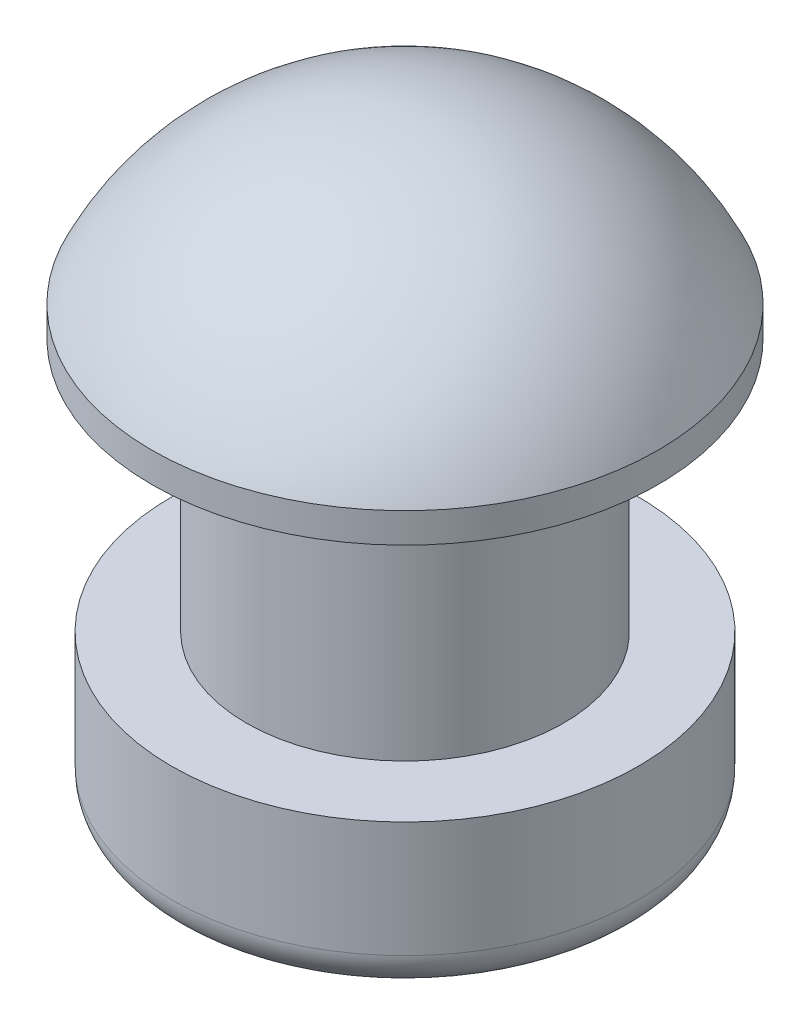
ISO-10303-21;
HEADER;
FILE_DESCRIPTION(('STEP AP214'),'2;1');
FILE_NAME('part.step','',(''),(''),'','','');
FILE_SCHEMA(('AUTOMOTIVE_DESIGN { 1 0 10303 214 1 1 1 1 }'));
ENDSEC;
DATA;
#1=APPLICATION_CONTEXT('core data for automotive mechanical design processes');
#2=APPLICATION_PROTOCOL_DEFINITION('international standard','automotive_design',2000,#1);
#3=PRODUCT_CONTEXT('',#1,'mechanical');
#4=PRODUCT('Part','Part','',(#3));
#5=PRODUCT_RELATED_PRODUCT_CATEGORY('part','',(#4));
#6=PRODUCT_DEFINITION_FORMATION('','',#4);
#7=PRODUCT_DEFINITION_CONTEXT('part definition',#1,'design');
#8=PRODUCT_DEFINITION('design','',#6,#7);
#9=PRODUCT_DEFINITION_SHAPE('','',#8);
#10=(LENGTH_UNIT() NAMED_UNIT(*) SI_UNIT(.MILLI.,.METRE.));
#11=(NAMED_UNIT(*) PLANE_ANGLE_UNIT() SI_UNIT($,.RADIAN.));
#12=(NAMED_UNIT(*) SI_UNIT($,.STERADIAN.) SOLID_ANGLE_UNIT());
#13=UNCERTAINTY_MEASURE_WITH_UNIT(LENGTH_MEASURE(1.E-05),#10,'distance_accuracy_value','');
#14=(GEOMETRIC_REPRESENTATION_CONTEXT(3) GLOBAL_UNCERTAINTY_ASSIGNED_CONTEXT((#13)) GLOBAL_UNIT_ASSIGNED_CONTEXT((#10,
#11,#12)) REPRESENTATION_CONTEXT('',''));
#15=CARTESIAN_POINT('',(0.,0.,0.));
#16=DIRECTION('',(0.,0.,1.));
#17=DIRECTION('',(1.,0.,0.));
#18=AXIS2_PLACEMENT_3D('',#15,#16,#17);
#19=CARTESIAN_POINT('',(0.,1.26999999999999,0.));
#20=DIRECTION('',(0.,1.,0.));
#21=DIRECTION('',(1.,0.,0.));
#22=AXIS2_PLACEMENT_3D('',#19,#20,#21);
#23=SPHERICAL_SURFACE('',#22,3.81);
#24=CARTESIAN_POINT('',(0.,2.8956,0.));
#25=DIRECTION('',(0.,1.,0.));
#26=DIRECTION('',(0.,0.,1.));
#27=AXIS2_PLACEMENT_3D('',#24,#25,#26);
#28=CIRCLE('',#27,3.44579811364508);
#29=CARTESIAN_POINT('',(0.,2.8956,3.44579811364508));
#30=VERTEX_POINT('',#29);
#31=EDGE_CURVE('E112',#30,#30,#28,.T.);
#32=ORIENTED_EDGE('',*,*,#31,.T.);
#33=EDGE_LOOP('',(#32));
#34=FACE_BOUND('',#33,.T.);
#35=ADVANCED_FACE('F36',(#34),#23,.T.);
#36=CARTESIAN_POINT('',(0.,5.37945263157895,0.));
#37=DIRECTION('',(0.,1.,0.));
#38=DIRECTION('',(0.,0.,1.));
#39=AXIS2_PLACEMENT_3D('',#36,#37,#38);
#40=CYLINDRICAL_SURFACE('',#39,3.44579811364508);
#41=ORIENTED_EDGE('',*,*,#31,.F.);
#42=EDGE_LOOP('',(#41));
#43=FACE_BOUND('',#42,.T.);
#44=CARTESIAN_POINT('',(0.,2.4892,0.));
#45=DIRECTION('',(0.,1.,0.));
#46=DIRECTION('',(0.,0.,1.));
#47=AXIS2_PLACEMENT_3D('',#44,#45,#46);
#48=CIRCLE('',#47,3.44579811364508);
#49=CARTESIAN_POINT('',(0.,2.4892,3.44579811364508));
#50=VERTEX_POINT('',#49);
#51=EDGE_CURVE('E109',#50,#50,#48,.T.);
#52=ORIENTED_EDGE('',*,*,#51,.T.);
#53=EDGE_LOOP('',(#52));
#54=FACE_BOUND('',#53,.T.);
#55=ADVANCED_FACE('F61',(#43,#54),#40,.T.);
#56=CARTESIAN_POINT('',(2.15899999999999,2.4892,0.));
#57=DIRECTION('',(0.,1.,0.));
#58=DIRECTION('',(0.,0.,1.));
#59=AXIS2_PLACEMENT_3D('',#56,#57,#58);
#60=PLANE('',#59);
#61=ORIENTED_EDGE('',*,*,#51,.F.);
#62=EDGE_LOOP('',(#61));
#63=FACE_BOUND('',#62,.T.);
#64=CARTESIAN_POINT('',(0.,2.4892,0.));
#65=DIRECTION('',(0.,1.,0.));
#66=DIRECTION('',(0.,0.,1.));
#67=AXIS2_PLACEMENT_3D('',#64,#65,#66);
#68=CIRCLE('',#67,2.159);
#69=CARTESIAN_POINT('',(0.,2.4892,2.159));
#70=VERTEX_POINT('',#69);
#71=EDGE_CURVE('E106',#70,#70,#68,.T.);
#72=ORIENTED_EDGE('',*,*,#71,.T.);
#73=EDGE_LOOP('',(#72));
#74=FACE_BOUND('',#73,.T.);
#75=ADVANCED_FACE('F66',(#63,#74),#60,.F.);
#76=CARTESIAN_POINT('',(0.,5.37945263157895,0.));
#77=DIRECTION('',(0.,1.,0.));
#78=DIRECTION('',(0.,0.,1.));
#79=AXIS2_PLACEMENT_3D('',#76,#77,#78);
#80=CYLINDRICAL_SURFACE('',#79,2.159);
#81=ORIENTED_EDGE('',*,*,#71,.F.);
#82=EDGE_LOOP('',(#81));
#83=FACE_BOUND('',#82,.T.);
#84=CARTESIAN_POINT('',(0.,-0.965199999999999,0.));
#85=DIRECTION('',(0.,1.,0.));
#86=DIRECTION('',(0.,0.,1.));
#87=AXIS2_PLACEMENT_3D('',#84,#85,#86);
#88=CIRCLE('',#87,2.159);
#89=CARTESIAN_POINT('',(0.,-0.965199999999999,2.159));
#90=VERTEX_POINT('',#89);
#91=EDGE_CURVE('E99',#90,#90,#88,.T.);
#92=ORIENTED_EDGE('',*,*,#91,.T.);
#93=EDGE_LOOP('',(#92));
#94=FACE_BOUND('',#93,.T.);
#95=ADVANCED_FACE('F73',(#83,#94),#80,.T.);
#96=CARTESIAN_POINT('',(3.17500000000001,-0.965199999999999,0.));
#97=DIRECTION('',(0.,-1.,0.));
#98=DIRECTION('',(0.,0.,-1.));
#99=AXIS2_PLACEMENT_3D('',#96,#97,#98);
#100=PLANE('',#99);
#101=ORIENTED_EDGE('',*,*,#91,.F.);
#102=EDGE_LOOP('',(#101));
#103=FACE_BOUND('',#102,.T.);
#104=CARTESIAN_POINT('',(0.,-0.965199999999999,0.));
#105=DIRECTION('',(0.,1.,0.));
#106=DIRECTION('',(0.,0.,1.));
#107=AXIS2_PLACEMENT_3D('',#104,#105,#106);
#108=CIRCLE('',#107,3.175);
#109=CARTESIAN_POINT('',(0.,-0.965199999999999,3.175));
#110=VERTEX_POINT('',#109);
#111=EDGE_CURVE('E95',#110,#110,#108,.T.);
#112=ORIENTED_EDGE('',*,*,#111,.T.);
#113=EDGE_LOOP('',(#112));
#114=FACE_BOUND('',#113,.T.);
#115=ADVANCED_FACE('F77',(#103,#114),#100,.F.);
#116=CARTESIAN_POINT('',(0.,5.37945263157895,0.));
#117=DIRECTION('',(0.,1.,0.));
#118=DIRECTION('',(0.,0.,1.));
#119=AXIS2_PLACEMENT_3D('',#116,#117,#118);
#120=CYLINDRICAL_SURFACE('',#119,3.175);
#121=CARTESIAN_POINT('',(0.,-2.54,0.));
#122=DIRECTION('',(0.,1.,0.));
#123=DIRECTION('',(0.,0.,1.));
#124=AXIS2_PLACEMENT_3D('',#121,#122,#123);
#125=CIRCLE('',#124,3.175);
#126=CARTESIAN_POINT('',(0.,-2.54,3.175));
#127=VERTEX_POINT('',#126);
#128=EDGE_CURVE('E43',#127,#127,#125,.T.);
#129=ORIENTED_EDGE('',*,*,#128,.T.);
#130=EDGE_LOOP('',(#129));
#131=FACE_BOUND('',#130,.T.);
#132=ORIENTED_EDGE('',*,*,#111,.F.);
#133=EDGE_LOOP('',(#132));
#134=FACE_BOUND('',#133,.T.);
#135=ADVANCED_FACE('F81',(#131,#134),#120,.T.);
#136=CARTESIAN_POINT('',(2.15899999999999,-3.048,0.));
#137=DIRECTION('',(0.,1.,0.));
#138=DIRECTION('',(0.,0.,1.));
#139=AXIS2_PLACEMENT_3D('',#136,#137,#138);
#140=PLANE('',#139);
#141=CARTESIAN_POINT('',(0.,-3.048,0.));
#142=DIRECTION('',(0.,1.,0.));
#143=DIRECTION('',(0.,0.,1.));
#144=AXIS2_PLACEMENT_3D('',#141,#142,#143);
#145=CIRCLE('',#144,2.667);
#146=CARTESIAN_POINT('',(0.,-3.048,2.667));
#147=VERTEX_POINT('',#146);
#148=EDGE_CURVE('E11',#147,#147,#145,.F.);
#149=ORIENTED_EDGE('',*,*,#148,.T.);
#150=EDGE_LOOP('',(#149));
#151=FACE_BOUND('',#150,.T.);
#152=CARTESIAN_POINT('',(0.,-3.048,0.));
#153=DIRECTION('',(0.,1.,0.));
#154=DIRECTION('',(0.,0.,1.));
#155=AXIS2_PLACEMENT_3D('',#152,#153,#154);
#156=CIRCLE('',#155,2.159);
#157=CARTESIAN_POINT('',(0.,-3.048,2.159));
#158=VERTEX_POINT('',#157);
#159=EDGE_CURVE('E94',#158,#158,#156,.T.);
#160=ORIENTED_EDGE('',*,*,#159,.T.);
#161=EDGE_LOOP('',(#160));
#162=FACE_BOUND('',#161,.T.);
#163=ADVANCED_FACE('F56',(#151,#162),#140,.F.);
#164=CARTESIAN_POINT('',(0.,5.37945263157895,0.));
#165=DIRECTION('',(0.,1.,0.));
#166=DIRECTION('',(0.,0.,1.));
#167=AXIS2_PLACEMENT_3D('',#164,#165,#166);
#168=CYLINDRICAL_SURFACE('',#167,2.159);
#169=ORIENTED_EDGE('',*,*,#159,.F.);
#170=EDGE_LOOP('',(#169));
#171=FACE_BOUND('',#170,.T.);
#172=CARTESIAN_POINT('',(0.,-1.778,0.));
#173=DIRECTION('',(0.,1.,0.));
#174=DIRECTION('',(0.,0.,1.));
#175=AXIS2_PLACEMENT_3D('',#172,#173,#174);
#176=CIRCLE('',#175,2.159);
#177=CARTESIAN_POINT('',(0.,-1.778,2.159));
#178=VERTEX_POINT('',#177);
#179=EDGE_CURVE('E96',#178,#178,#176,.T.);
#180=ORIENTED_EDGE('',*,*,#179,.T.);
#181=EDGE_LOOP('',(#180));
#182=FACE_BOUND('',#181,.T.);
#183=ADVANCED_FACE('F48',(#171,#182),#168,.F.);
#184=CARTESIAN_POINT('',(0.,-3.41280990949762,-0.998931690174505));
#185=DIRECTION('',(-1.,0.,0.));
#186=DIRECTION('',(0.,0.,1.));
#187=AXIS2_PLACEMENT_3D('',#184,#185,#186);
#188=CIRCLE('',#187,3.556);
#189=TRIMMED_CURVE('',#188,(PARAMETER_VALUE(-1.2860495605504)),
(PARAMETER_VALUE(1.2860495605504)),.T.,.PARAMETER.);
#190=CARTESIAN_POINT('',(0.,-3.41280990949762,0.));
#191=DIRECTION('',(0.,1.,0.));
#192=AXIS1_PLACEMENT('',#190,#191);
#193=SURFACE_OF_REVOLUTION('',#189,#192);
#194=ORIENTED_EDGE('',*,*,#179,.F.);
#195=EDGE_LOOP('',(#194));
#196=FACE_BOUND('',#195,.T.);
#197=CARTESIAN_POINT('',(0.,0.,0.));
#198=VERTEX_POINT('',#197);
#199=VERTEX_LOOP('',#198);
#200=FACE_BOUND('',#199,.T.);
#201=ADVANCED_FACE('F46',(#196,#200),#193,.F.);
#202=CARTESIAN_POINT('',(0.,-2.54,0.));
#203=DIRECTION('',(0.,1.,0.));
#204=DIRECTION('',(0.,0.,1.));
#205=AXIS2_PLACEMENT_3D('',#202,#203,#204);
#206=TOROIDAL_SURFACE('',#205,2.667,0.508);
#207=ORIENTED_EDGE('',*,*,#148,.F.);
#208=EDGE_LOOP('',(#207));
#209=FACE_BOUND('',#208,.T.);
#210=ORIENTED_EDGE('',*,*,#128,.F.);
#211=EDGE_LOOP('',(#210));
#212=FACE_BOUND('',#211,.T.);
#213=ADVANCED_FACE('F38',(#209,#212),#206,.T.);
#214=CLOSED_SHELL('',(#35,#55,#75,#95,#115,#135,#163,#183,#201,#213));
#215=MANIFOLD_SOLID_BREP('B2',#214);
#216=ADVANCED_BREP_SHAPE_REPRESENTATION('',(#18,#215),#14);
#217=SHAPE_DEFINITION_REPRESENTATION(#9,#216);
ENDSEC;
END-ISO-10303-21;
